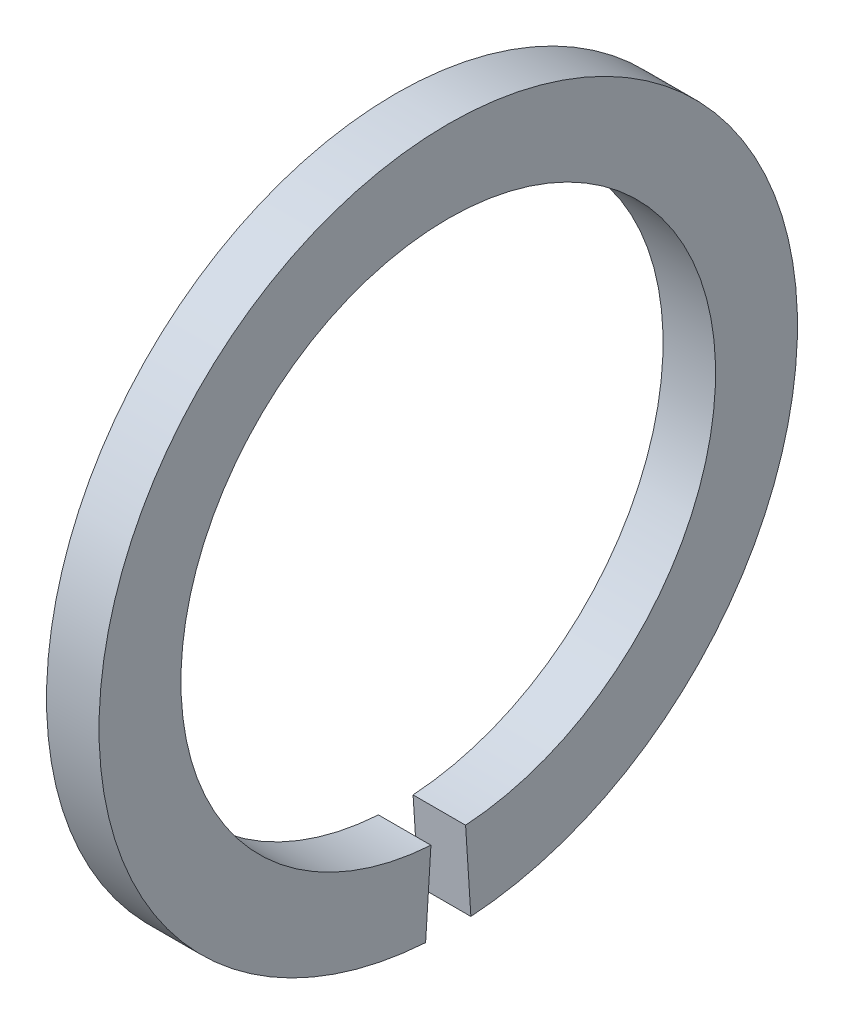
ISO-10303-21;
HEADER;
FILE_DESCRIPTION(('STEP AP214'),'2;1');
FILE_NAME('part.step','',(''),(''),'','','');
FILE_SCHEMA(('AUTOMOTIVE_DESIGN { 1 0 10303 214 1 1 1 1 }'));
ENDSEC;
DATA;
#1=APPLICATION_CONTEXT('core data for automotive mechanical design processes');
#2=APPLICATION_PROTOCOL_DEFINITION('international standard','automotive_design',2000,#1);
#3=PRODUCT_CONTEXT('',#1,'mechanical');
#4=PRODUCT('Part','Part','',(#3));
#5=PRODUCT_RELATED_PRODUCT_CATEGORY('part','',(#4));
#6=PRODUCT_DEFINITION_FORMATION('','',#4);
#7=PRODUCT_DEFINITION_CONTEXT('part definition',#1,'design');
#8=PRODUCT_DEFINITION('design','',#6,#7);
#9=PRODUCT_DEFINITION_SHAPE('','',#8);
#10=(LENGTH_UNIT() NAMED_UNIT(*) SI_UNIT(.MILLI.,.METRE.));
#11=(NAMED_UNIT(*) PLANE_ANGLE_UNIT() SI_UNIT($,.RADIAN.));
#12=(NAMED_UNIT(*) SI_UNIT($,.STERADIAN.) SOLID_ANGLE_UNIT());
#13=UNCERTAINTY_MEASURE_WITH_UNIT(LENGTH_MEASURE(1.E-05),#10,'distance_accuracy_value','');
#14=(GEOMETRIC_REPRESENTATION_CONTEXT(3) GLOBAL_UNCERTAINTY_ASSIGNED_CONTEXT((#13)) GLOBAL_UNIT_ASSIGNED_CONTEXT((#10,
#11,#12)) REPRESENTATION_CONTEXT('',''));
#15=CARTESIAN_POINT('',(0.,0.,0.));
#16=DIRECTION('',(0.,0.,1.));
#17=DIRECTION('',(1.,0.,0.));
#18=AXIS2_PLACEMENT_3D('',#15,#16,#17);
#19=CARTESIAN_POINT('',(1.09,0.,0.));
#20=DIRECTION('',(-1.,0.,0.));
#21=DIRECTION('',(0.,0.,1.));
#22=AXIS2_PLACEMENT_3D('',#19,#20,#21);
#23=CYLINDRICAL_SURFACE('',#22,7.25);
#24=CARTESIAN_POINT('',(0.,0.,0.));
#25=DIRECTION('',(1.,0.,0.));
#26=DIRECTION('',(0.,0.,-1.));
#27=AXIS2_PLACEMENT_3D('',#24,#25,#26);
#28=CIRCLE('',#27,7.25);
#29=CARTESIAN_POINT('',(0.,-7.23475458940461,-0.469921303080527));
#30=VERTEX_POINT('',#29);
#31=CARTESIAN_POINT('',(0.,-7.23475458940461,0.469921303080526));
#32=VERTEX_POINT('',#31);
#33=EDGE_CURVE('E99',#30,#32,#28,.T.);
#34=ORIENTED_EDGE('',*,*,#33,.T.);
#35=DIRECTION('',(-1.,0.,0.));
#36=VECTOR('',#35,1.);
#37=CARTESIAN_POINT('',(1.09,-7.23475458940461,0.469921303080526));
#38=LINE('',#37,#36);
#39=CARTESIAN_POINT('',(1.09,-7.23475458940461,0.469921303080526));
#40=VERTEX_POINT('',#39);
#41=EDGE_CURVE('E11',#40,#32,#38,.T.);
#42=ORIENTED_EDGE('',*,*,#41,.F.);
#43=CARTESIAN_POINT('',(1.09,0.,0.));
#44=DIRECTION('',(1.,0.,0.));
#45=DIRECTION('',(0.,0.,-1.));
#46=AXIS2_PLACEMENT_3D('',#43,#44,#45);
#47=CIRCLE('',#46,7.25);
#48=CARTESIAN_POINT('',(1.09,-7.23475458940461,-0.469921303080527));
#49=VERTEX_POINT('',#48);
#50=EDGE_CURVE('E87',#49,#40,#47,.T.);
#51=ORIENTED_EDGE('',*,*,#50,.F.);
#52=DIRECTION('',(-1.,0.,0.));
#53=VECTOR('',#52,1.);
#54=CARTESIAN_POINT('',(1.09,-7.23475458940461,-0.469921303080527));
#55=LINE('',#54,#53);
#56=EDGE_CURVE('E95',#49,#30,#55,.T.);
#57=ORIENTED_EDGE('',*,*,#56,.T.);
#58=EDGE_LOOP('',(#34,#42,#51,#57));
#59=FACE_BOUND('',#58,.T.);
#60=ADVANCED_FACE('F36',(#59),#23,.T.);
#61=CARTESIAN_POINT('',(1.09,-5.53832937533732,0.359732859599576));
#62=DIRECTION('',(0.,0.0648167314593825,0.997897184745464));
#63=DIRECTION('',(0.,-0.997897184745464,0.0648167314593826));
#64=AXIS2_PLACEMENT_3D('',#61,#62,#63);
#65=PLANE('',#64);
#66=DIRECTION('',(0.,0.997897184745464,-0.0648167314593826));
#67=VECTOR('',#66,1.);
#68=CARTESIAN_POINT('',(0.,-5.53832937533732,0.359732859599576));
#69=LINE('',#68,#67);
#70=CARTESIAN_POINT('',(0.,-5.53832937533732,0.359732859599575));
#71=VERTEX_POINT('',#70);
#72=EDGE_CURVE('E91',#32,#71,#69,.T.);
#73=ORIENTED_EDGE('',*,*,#72,.T.);
#74=DIRECTION('',(-1.,0.,0.));
#75=VECTOR('',#74,1.);
#76=CARTESIAN_POINT('',(1.09,-5.53832937533732,0.359732859599575));
#77=LINE('',#76,#75);
#78=CARTESIAN_POINT('',(1.09,-5.53832937533732,0.359732859599575));
#79=VERTEX_POINT('',#78);
#80=EDGE_CURVE('E44',#79,#71,#77,.T.);
#81=ORIENTED_EDGE('',*,*,#80,.F.);
#82=DIRECTION('',(0.,0.997897184745464,-0.0648167314593826));
#83=VECTOR('',#82,1.);
#84=CARTESIAN_POINT('',(1.09,-5.53832937533732,0.359732859599576));
#85=LINE('',#84,#83);
#86=EDGE_CURVE('E82',#40,#79,#85,.T.);
#87=ORIENTED_EDGE('',*,*,#86,.F.);
#88=ORIENTED_EDGE('',*,*,#41,.T.);
#89=EDGE_LOOP('',(#73,#81,#87,#88));
#90=FACE_BOUND('',#89,.T.);
#91=ADVANCED_FACE('F90',(#90),#65,.F.);
#92=CARTESIAN_POINT('',(1.09,0.,0.));
#93=DIRECTION('',(-1.,0.,0.));
#94=DIRECTION('',(0.,0.,1.));
#95=AXIS2_PLACEMENT_3D('',#92,#93,#94);
#96=CYLINDRICAL_SURFACE('',#95,5.55);
#97=CARTESIAN_POINT('',(0.,0.,0.));
#98=DIRECTION('',(-1.,0.,0.));
#99=DIRECTION('',(0.,0.,-1.));
#100=AXIS2_PLACEMENT_3D('',#97,#98,#99);
#101=CIRCLE('',#100,5.55);
#102=CARTESIAN_POINT('',(0.,-5.53832937533732,-0.359732859599579));
#103=VERTEX_POINT('',#102);
#104=EDGE_CURVE('E69',#71,#103,#101,.T.);
#105=ORIENTED_EDGE('',*,*,#104,.T.);
#106=DIRECTION('',(-1.,0.,0.));
#107=VECTOR('',#106,1.);
#108=CARTESIAN_POINT('',(1.09,-5.53832937533732,-0.359732859599579));
#109=LINE('',#108,#107);
#110=CARTESIAN_POINT('',(1.09,-5.53832937533732,-0.359732859599579));
#111=VERTEX_POINT('',#110);
#112=EDGE_CURVE('E92',#111,#103,#109,.T.);
#113=ORIENTED_EDGE('',*,*,#112,.F.);
#114=CARTESIAN_POINT('',(1.09,0.,0.));
#115=DIRECTION('',(-1.,0.,0.));
#116=DIRECTION('',(0.,0.,-1.));
#117=AXIS2_PLACEMENT_3D('',#114,#115,#116);
#118=CIRCLE('',#117,5.55);
#119=EDGE_CURVE('E85',#79,#111,#118,.T.);
#120=ORIENTED_EDGE('',*,*,#119,.F.);
#121=ORIENTED_EDGE('',*,*,#80,.T.);
#122=EDGE_LOOP('',(#105,#113,#120,#121));
#123=FACE_BOUND('',#122,.T.);
#124=ADVANCED_FACE('F93',(#123),#96,.F.);
#125=CARTESIAN_POINT('',(1.09,-5.53832937533732,-0.359732859599579));
#126=DIRECTION('',(0.,0.064816731459381,-0.997897184745464));
#127=DIRECTION('',(0.,0.997897184745464,0.064816731459381));
#128=AXIS2_PLACEMENT_3D('',#125,#126,#127);
#129=PLANE('',#128);
#130=DIRECTION('',(0.,-0.997897184745464,-0.064816731459381));
#131=VECTOR('',#130,1.);
#132=CARTESIAN_POINT('',(0.,-5.53832937533732,-0.359732859599579));
#133=LINE('',#132,#131);
#134=EDGE_CURVE('E75',#103,#30,#133,.T.);
#135=ORIENTED_EDGE('',*,*,#134,.T.);
#136=ORIENTED_EDGE('',*,*,#56,.F.);
#137=DIRECTION('',(0.,-0.997897184745464,-0.064816731459381));
#138=VECTOR('',#137,1.);
#139=CARTESIAN_POINT('',(1.09,-5.53832937533732,-0.359732859599579));
#140=LINE('',#139,#138);
#141=EDGE_CURVE('E52',#111,#49,#140,.T.);
#142=ORIENTED_EDGE('',*,*,#141,.F.);
#143=ORIENTED_EDGE('',*,*,#112,.T.);
#144=EDGE_LOOP('',(#135,#136,#142,#143));
#145=FACE_BOUND('',#144,.T.);
#146=ADVANCED_FACE('F106',(#145),#129,.F.);
#147=CARTESIAN_POINT('',(1.09,0.,0.));
#148=DIRECTION('',(1.,0.,0.));
#149=DIRECTION('',(0.,0.,-1.));
#150=AXIS2_PLACEMENT_3D('',#147,#148,#149);
#151=PLANE('',#150);
#152=ORIENTED_EDGE('',*,*,#50,.T.);
#153=ORIENTED_EDGE('',*,*,#86,.T.);
#154=ORIENTED_EDGE('',*,*,#119,.T.);
#155=ORIENTED_EDGE('',*,*,#141,.T.);
#156=EDGE_LOOP('',(#152,#153,#154,#155));
#157=FACE_BOUND('',#156,.T.);
#158=ADVANCED_FACE('F83',(#157),#151,.T.);
#159=CARTESIAN_POINT('',(0.,0.,0.));
#160=DIRECTION('',(1.,0.,0.));
#161=DIRECTION('',(0.,0.,-1.));
#162=AXIS2_PLACEMENT_3D('',#159,#160,#161);
#163=PLANE('',#162);
#164=ORIENTED_EDGE('',*,*,#33,.F.);
#165=ORIENTED_EDGE('',*,*,#134,.F.);
#166=ORIENTED_EDGE('',*,*,#104,.F.);
#167=ORIENTED_EDGE('',*,*,#72,.F.);
#168=EDGE_LOOP('',(#164,#165,#166,#167));
#169=FACE_BOUND('',#168,.T.);
#170=ADVANCED_FACE('F109',(#169),#163,.F.);
#171=CLOSED_SHELL('',(#60,#91,#124,#146,#158,#170));
#172=MANIFOLD_SOLID_BREP('B2',#171);
#173=ADVANCED_BREP_SHAPE_REPRESENTATION('',(#18,#172),#14);
#174=SHAPE_DEFINITION_REPRESENTATION(#9,#173);
ENDSEC;
END-ISO-10303-21;
